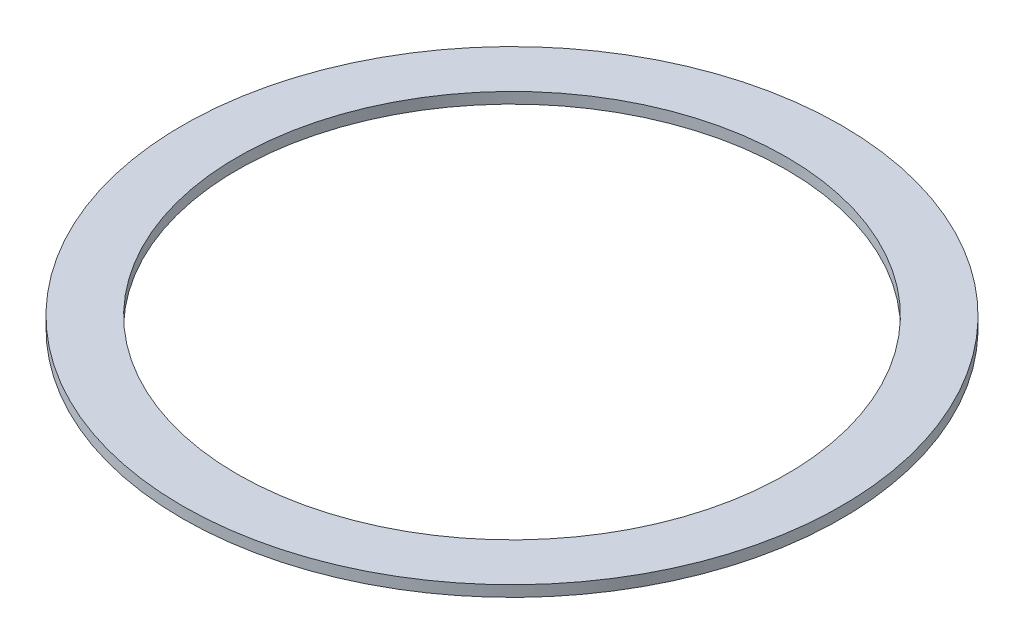
ISO-10303-21;
HEADER;
FILE_DESCRIPTION(('STEP AP214'),'2;1');
FILE_NAME('part.step','',(''),(''),'','','');
FILE_SCHEMA(('AUTOMOTIVE_DESIGN { 1 0 10303 214 1 1 1 1 }'));
ENDSEC;
DATA;
#1=APPLICATION_CONTEXT('core data for automotive mechanical design processes');
#2=APPLICATION_PROTOCOL_DEFINITION('international standard','automotive_design',2000,#1);
#3=PRODUCT_CONTEXT('',#1,'mechanical');
#4=PRODUCT('Part','Part','',(#3));
#5=PRODUCT_RELATED_PRODUCT_CATEGORY('part','',(#4));
#6=PRODUCT_DEFINITION_FORMATION('','',#4);
#7=PRODUCT_DEFINITION_CONTEXT('part definition',#1,'design');
#8=PRODUCT_DEFINITION('design','',#6,#7);
#9=PRODUCT_DEFINITION_SHAPE('','',#8);
#10=(LENGTH_UNIT() NAMED_UNIT(*) SI_UNIT(.MILLI.,.METRE.));
#11=(NAMED_UNIT(*) PLANE_ANGLE_UNIT() SI_UNIT($,.RADIAN.));
#12=(NAMED_UNIT(*) SI_UNIT($,.STERADIAN.) SOLID_ANGLE_UNIT());
#13=UNCERTAINTY_MEASURE_WITH_UNIT(LENGTH_MEASURE(1.E-05),#10,'distance_accuracy_value','');
#14=(GEOMETRIC_REPRESENTATION_CONTEXT(3) GLOBAL_UNCERTAINTY_ASSIGNED_CONTEXT((#13)) GLOBAL_UNIT_ASSIGNED_CONTEXT((#10,
#11,#12)) REPRESENTATION_CONTEXT('',''));
#15=CARTESIAN_POINT('',(0.,0.,0.));
#16=DIRECTION('',(0.,0.,1.));
#17=DIRECTION('',(1.,0.,0.));
#18=AXIS2_PLACEMENT_3D('',#15,#16,#17);
#19=CARTESIAN_POINT('',(0.,131.034482758621,0.));
#20=DIRECTION('',(0.,1.,0.));
#21=DIRECTION('',(0.,0.,1.));
#22=AXIS2_PLACEMENT_3D('',#19,#20,#21);
#23=CYLINDRICAL_SURFACE('',#22,50.);
#24=CARTESIAN_POINT('',(0.,-1.,0.));
#25=DIRECTION('',(0.,1.,0.));
#26=DIRECTION('',(0.,0.,1.));
#27=AXIS2_PLACEMENT_3D('',#24,#25,#26);
#28=CIRCLE('',#27,50.);
#29=CARTESIAN_POINT('',(0.,-1.,50.));
#30=VERTEX_POINT('',#29);
#31=EDGE_CURVE('E10',#30,#30,#28,.T.);
#32=ORIENTED_EDGE('',*,*,#31,.F.);
#33=EDGE_LOOP('',(#32));
#34=FACE_BOUND('',#33,.T.);
#35=CARTESIAN_POINT('',(0.,1.,0.));
#36=DIRECTION('',(0.,1.,0.));
#37=DIRECTION('',(0.,0.,1.));
#38=AXIS2_PLACEMENT_3D('',#35,#36,#37);
#39=CIRCLE('',#38,50.);
#40=CARTESIAN_POINT('',(0.,1.,50.));
#41=VERTEX_POINT('',#40);
#42=EDGE_CURVE('E49',#41,#41,#39,.T.);
#43=ORIENTED_EDGE('',*,*,#42,.T.);
#44=EDGE_LOOP('',(#43));
#45=FACE_BOUND('',#44,.T.);
#46=ADVANCED_FACE('F35',(#34,#45),#23,.F.);
#47=CARTESIAN_POINT('',(50.,-1.,0.));
#48=DIRECTION('',(0.,1.,0.));
#49=DIRECTION('',(0.,0.,1.));
#50=AXIS2_PLACEMENT_3D('',#47,#48,#49);
#51=PLANE('',#50);
#52=CARTESIAN_POINT('',(0.,-1.,0.));
#53=DIRECTION('',(0.,1.,0.));
#54=DIRECTION('',(0.,0.,1.));
#55=AXIS2_PLACEMENT_3D('',#52,#53,#54);
#56=CIRCLE('',#55,60.);
#57=CARTESIAN_POINT('',(0.,-1.,60.));
#58=VERTEX_POINT('',#57);
#59=EDGE_CURVE('E41',#58,#58,#56,.T.);
#60=ORIENTED_EDGE('',*,*,#59,.F.);
#61=EDGE_LOOP('',(#60));
#62=FACE_BOUND('',#61,.T.);
#63=ORIENTED_EDGE('',*,*,#31,.T.);
#64=EDGE_LOOP('',(#63));
#65=FACE_BOUND('',#64,.T.);
#66=ADVANCED_FACE('F64',(#62,#65),#51,.F.);
#67=CARTESIAN_POINT('',(0.,131.034482758621,0.));
#68=DIRECTION('',(0.,1.,0.));
#69=DIRECTION('',(0.,0.,1.));
#70=AXIS2_PLACEMENT_3D('',#67,#68,#69);
#71=CYLINDRICAL_SURFACE('',#70,60.);
#72=CARTESIAN_POINT('',(0.,1.,0.));
#73=DIRECTION('',(0.,1.,0.));
#74=DIRECTION('',(0.,0.,1.));
#75=AXIS2_PLACEMENT_3D('',#72,#73,#74);
#76=CIRCLE('',#75,60.);
#77=CARTESIAN_POINT('',(0.,1.,60.));
#78=VERTEX_POINT('',#77);
#79=EDGE_CURVE('E45',#78,#78,#76,.T.);
#80=ORIENTED_EDGE('',*,*,#79,.F.);
#81=EDGE_LOOP('',(#80));
#82=FACE_BOUND('',#81,.T.);
#83=ORIENTED_EDGE('',*,*,#59,.T.);
#84=EDGE_LOOP('',(#83));
#85=FACE_BOUND('',#84,.T.);
#86=ADVANCED_FACE('F59',(#82,#85),#71,.T.);
#87=CARTESIAN_POINT('',(50.,1.,0.));
#88=DIRECTION('',(0.,-1.,0.));
#89=DIRECTION('',(0.,0.,-1.));
#90=AXIS2_PLACEMENT_3D('',#87,#88,#89);
#91=PLANE('',#90);
#92=ORIENTED_EDGE('',*,*,#42,.F.);
#93=EDGE_LOOP('',(#92));
#94=FACE_BOUND('',#93,.T.);
#95=ORIENTED_EDGE('',*,*,#79,.T.);
#96=EDGE_LOOP('',(#95));
#97=FACE_BOUND('',#96,.T.);
#98=ADVANCED_FACE('F56',(#94,#97),#91,.F.);
#99=CLOSED_SHELL('',(#46,#66,#86,#98));
#100=MANIFOLD_SOLID_BREP('B2',#99);
#101=ADVANCED_BREP_SHAPE_REPRESENTATION('',(#18,#100),#14);
#102=SHAPE_DEFINITION_REPRESENTATION(#9,#101);
ENDSEC;
END-ISO-10303-21;
